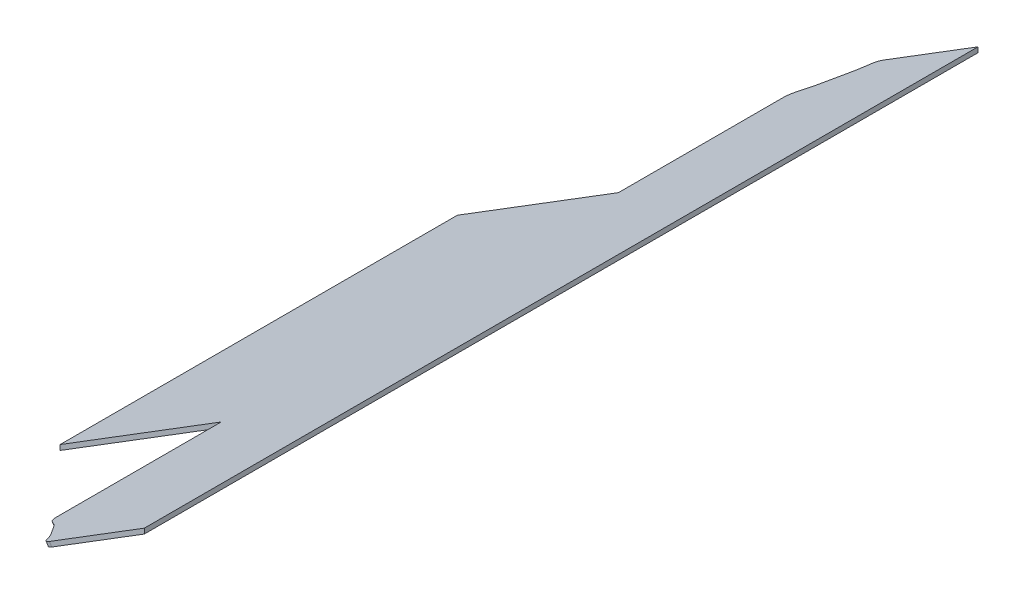
ISO-10303-21;
HEADER;
FILE_DESCRIPTION(('STEP AP214'),'2;1');
FILE_NAME('part.step','',(''),(''),'','','');
FILE_SCHEMA(('AUTOMOTIVE_DESIGN { 1 0 10303 214 1 1 1 1 }'));
ENDSEC;
DATA;
#1=APPLICATION_CONTEXT('core data for automotive mechanical design processes');
#2=APPLICATION_PROTOCOL_DEFINITION('international standard','automotive_design',2000,#1);
#3=PRODUCT_CONTEXT('',#1,'mechanical');
#4=PRODUCT('Part','Part','',(#3));
#5=PRODUCT_RELATED_PRODUCT_CATEGORY('part','',(#4));
#6=PRODUCT_DEFINITION_FORMATION('','',#4);
#7=PRODUCT_DEFINITION_CONTEXT('part definition',#1,'design');
#8=PRODUCT_DEFINITION('design','',#6,#7);
#9=PRODUCT_DEFINITION_SHAPE('','',#8);
#10=(LENGTH_UNIT() NAMED_UNIT(*) SI_UNIT(.MILLI.,.METRE.));
#11=(NAMED_UNIT(*) PLANE_ANGLE_UNIT() SI_UNIT($,.RADIAN.));
#12=(NAMED_UNIT(*) SI_UNIT($,.STERADIAN.) SOLID_ANGLE_UNIT());
#13=UNCERTAINTY_MEASURE_WITH_UNIT(LENGTH_MEASURE(1.E-05),#10,'distance_accuracy_value','');
#14=(GEOMETRIC_REPRESENTATION_CONTEXT(3) GLOBAL_UNCERTAINTY_ASSIGNED_CONTEXT((#13)) GLOBAL_UNIT_ASSIGNED_CONTEXT((#10,
#11,#12)) REPRESENTATION_CONTEXT('',''));
#15=CARTESIAN_POINT('',(0.,0.,0.));
#16=DIRECTION('',(0.,0.,1.));
#17=DIRECTION('',(1.,0.,0.));
#18=AXIS2_PLACEMENT_3D('',#15,#16,#17);
#19=CARTESIAN_POINT('',(541.055631695231,-76.6987176704867,-402.));
#20=DIRECTION('',(0.,0.,-1.));
#21=DIRECTION('',(-1.,0.,0.));
#22=AXIS2_PLACEMENT_3D('',#19,#20,#21);
#23=PLANE('',#22);
#24=DIRECTION('',(-0.849358835243342,-0.527815847615505,0.));
#25=VECTOR('',#24,1.);
#26=CARTESIAN_POINT('',(541.055631695231,-76.6987176704867,-402.));
#27=LINE('',#26,#25);
#28=CARTESIAN_POINT('',(540.,-77.3547173668089,-402.));
#29=VERTEX_POINT('',#28);
#30=CARTESIAN_POINT('',(497.563195868681,-103.726159934128,-402.));
#31=VERTEX_POINT('',#30);
#32=EDGE_CURVE('E179',#29,#31,#27,.T.);
#33=ORIENTED_EDGE('',*,*,#32,.T.);
#34=DIRECTION('',(-0.527815847615505,0.849358835243342,0.));
#35=VECTOR('',#34,1.);
#36=CARTESIAN_POINT('',(496.50756417345,-102.027442263642,-402.));
#37=LINE('',#36,#35);
#38=CARTESIAN_POINT('',(496.50756417345,-102.027442263642,-402.));
#39=VERTEX_POINT('',#38);
#40=EDGE_CURVE('E48',#31,#39,#37,.T.);
#41=ORIENTED_EDGE('',*,*,#40,.T.);
#42=DIRECTION('',(-0.849358835243342,-0.527815847615505,0.));
#43=VECTOR('',#42,1.);
#44=CARTESIAN_POINT('',(540.,-75.,-402.));
#45=LINE('',#44,#43);
#46=CARTESIAN_POINT('',(540.,-75.,-402.));
#47=VERTEX_POINT('',#46);
#48=EDGE_CURVE('E178',#47,#39,#45,.T.);
#49=ORIENTED_EDGE('',*,*,#48,.F.);
#50=DIRECTION('',(0.,1.,0.));
#51=VECTOR('',#50,1.);
#52=CARTESIAN_POINT('',(540.,-75.,-402.));
#53=LINE('',#52,#51);
#54=EDGE_CURVE('E198',#29,#47,#53,.T.);
#55=ORIENTED_EDGE('',*,*,#54,.F.);
#56=EDGE_LOOP('',(#33,#41,#49,#55));
#57=FACE_BOUND('',#56,.T.);
#58=ADVANCED_FACE('F40',(#57),#23,.T.);
#59=CARTESIAN_POINT('',(540.,-75.,-20.));
#60=DIRECTION('',(1.,0.,0.));
#61=DIRECTION('',(0.,1.,0.));
#62=AXIS2_PLACEMENT_3D('',#59,#60,#61);
#63=PLANE('',#62);
#64=DIRECTION('',(0.,0.,-1.));
#65=VECTOR('',#64,1.);
#66=CARTESIAN_POINT('',(540.,-75.,-20.));
#67=LINE('',#66,#65);
#68=CARTESIAN_POINT('',(540.,-75.,-20.));
#69=VERTEX_POINT('',#68);
#70=EDGE_CURVE('E182',#69,#47,#67,.T.);
#71=ORIENTED_EDGE('',*,*,#70,.F.);
#72=DIRECTION('',(0.,1.,0.));
#73=VECTOR('',#72,1.);
#74=CARTESIAN_POINT('',(540.,-162.811924253464,-20.));
#75=LINE('',#74,#73);
#76=CARTESIAN_POINT('',(540.,-77.3547173668088,-20.));
#77=VERTEX_POINT('',#76);
#78=EDGE_CURVE('E205',#77,#69,#75,.T.);
#79=ORIENTED_EDGE('',*,*,#78,.F.);
#80=DIRECTION('',(0.,0.,-1.));
#81=VECTOR('',#80,1.);
#82=CARTESIAN_POINT('',(540.,-77.3547173668089,0.));
#83=LINE('',#82,#81);
#84=EDGE_CURVE('E185',#77,#29,#83,.T.);
#85=ORIENTED_EDGE('',*,*,#84,.T.);
#86=ORIENTED_EDGE('',*,*,#54,.T.);
#87=EDGE_LOOP('',(#71,#79,#85,#86));
#88=FACE_BOUND('',#87,.T.);
#89=ADVANCED_FACE('F309',(#88),#63,.T.);
#90=CARTESIAN_POINT('',(402.482655584692,-162.811924253465,-20.));
#91=DIRECTION('',(0.,0.,1.));
#92=DIRECTION('',(1.,0.,0.));
#93=AXIS2_PLACEMENT_3D('',#90,#91,#92);
#94=PLANE('',#93);
#95=DIRECTION('',(0.849358835243342,0.527815847615505,0.));
#96=VECTOR('',#95,1.);
#97=CARTESIAN_POINT('',(401.427023889461,-161.113206582978,-20.));
#98=LINE('',#97,#96);
#99=CARTESIAN_POINT('',(496.50756417345,-102.027442263642,-20.));
#100=VERTEX_POINT('',#99);
#101=EDGE_CURVE('E190',#100,#69,#98,.T.);
#102=ORIENTED_EDGE('',*,*,#101,.F.);
#103=DIRECTION('',(-0.527815847615505,0.849358835243342,0.));
#104=VECTOR('',#103,1.);
#105=CARTESIAN_POINT('',(497.563195868681,-103.726159934128,-20.));
#106=LINE('',#105,#104);
#107=CARTESIAN_POINT('',(497.563195868681,-103.726159934128,-20.));
#108=VERTEX_POINT('',#107);
#109=EDGE_CURVE('E203',#100,#108,#106,.F.);
#110=ORIENTED_EDGE('',*,*,#109,.T.);
#111=DIRECTION('',(0.849358835243342,0.527815847615505,0.));
#112=VECTOR('',#111,1.);
#113=CARTESIAN_POINT('',(402.482655584692,-162.811924253465,-20.));
#114=LINE('',#113,#112);
#115=EDGE_CURVE('E183',#108,#77,#114,.T.);
#116=ORIENTED_EDGE('',*,*,#115,.T.);
#117=ORIENTED_EDGE('',*,*,#78,.T.);
#118=EDGE_LOOP('',(#102,#110,#116,#117));
#119=FACE_BOUND('',#118,.T.);
#120=ADVANCED_FACE('F314',(#119),#94,.T.);
#121=CARTESIAN_POINT('',(401.427023889461,-161.113206582978,-402.));
#122=DIRECTION('',(-1.,0.,0.));
#123=DIRECTION('',(0.,-1.,0.));
#124=AXIS2_PLACEMENT_3D('',#121,#122,#123);
#125=PLANE('',#124);
#126=DIRECTION('',(0.,-1.,0.));
#127=VECTOR('',#126,1.);
#128=CARTESIAN_POINT('',(401.427023889461,-53.1268140620597,-302.));
#129=LINE('',#128,#127);
#130=CARTESIAN_POINT('',(401.427023889461,-161.113206582978,-302.));
#131=VERTEX_POINT('',#130);
#132=CARTESIAN_POINT('',(401.427023889461,-163.467923949787,-302.));
#133=VERTEX_POINT('',#132);
#134=EDGE_CURVE('E159',#131,#133,#129,.T.);
#135=ORIENTED_EDGE('',*,*,#134,.T.);
#136=DIRECTION('',(0.,0.,1.));
#137=VECTOR('',#136,1.);
#138=CARTESIAN_POINT('',(401.427023889461,-163.467923949787,0.));
#139=LINE('',#138,#137);
#140=CARTESIAN_POINT('',(401.427023889461,-163.467923949787,-120.));
#141=VERTEX_POINT('',#140);
#142=EDGE_CURVE('E165',#133,#141,#139,.T.);
#143=ORIENTED_EDGE('',*,*,#142,.T.);
#144=DIRECTION('',(0.,-1.,0.));
#145=VECTOR('',#144,1.);
#146=CARTESIAN_POINT('',(401.427023889461,-161.113206582978,-120.));
#147=LINE('',#146,#145);
#148=CARTESIAN_POINT('',(401.427023889461,-161.113206582978,-120.));
#149=VERTEX_POINT('',#148);
#150=EDGE_CURVE('E175',#149,#141,#147,.T.);
#151=ORIENTED_EDGE('',*,*,#150,.F.);
#152=DIRECTION('',(0.,0.,1.));
#153=VECTOR('',#152,1.);
#154=CARTESIAN_POINT('',(401.427023889461,-161.113206582978,-402.));
#155=LINE('',#154,#153);
#156=EDGE_CURVE('E188',#131,#149,#155,.T.);
#157=ORIENTED_EDGE('',*,*,#156,.F.);
#158=EDGE_LOOP('',(#135,#143,#151,#157));
#159=FACE_BOUND('',#158,.T.);
#160=ADVANCED_FACE('F302',(#159),#125,.T.);
#161=CARTESIAN_POINT('',(185.116877968557,-297.88922891492,0.));
#162=DIRECTION('',(-0.527815847615505,0.849358835243342,0.));
#163=DIRECTION('',(-0.849358835243342,-0.527815847615505,0.));
#164=AXIS2_PLACEMENT_3D('',#161,#162,#163);
#165=PLANE('',#164);
#166=ORIENTED_EDGE('',*,*,#115,.F.);
#167=CARTESIAN_POINT('',(497.563195868681,-103.726159934128,-24.9999999999999));
#168=DIRECTION('',(-0.527815847615505,0.849358835243342,0.));
#169=DIRECTION('',(-0.849358835243342,-0.527815847615505,0.));
#170=AXIS2_PLACEMENT_3D('',#167,#168,#169);
#171=CIRCLE('',#170,5.);
#172=CARTESIAN_POINT('',(493.868957928557,-106.021864939777,-22.5337590205372));
#173=VERTEX_POINT('',#172);
#174=EDGE_CURVE('E222',#108,#173,#171,.F.);
#175=ORIENTED_EDGE('',*,*,#174,.T.);
#176=CARTESIAN_POINT('',(476.285871518514,-116.948497208875,-42.));
#177=CARTESIAN_POINT('',(479.252121913213,-115.105184463598,-39.9428083779639));
#178=CARTESIAN_POINT('',(483.497204374044,-112.467168934367,-36.6607125587044));
#179=CARTESIAN_POINT('',(487.786131782636,-109.801906901885,-31.0607814123332));
#180=CARTESIAN_POINT('',(491.811302310751,-107.300550930842,-26.6967487919227));
#181=CARTESIAN_POINT('',(493.914817597638,-105.993366431134,-22.694365368637));
#182=CARTESIAN_POINT('',(494.971765893868,-105.336548561334,-20.));
#183=B_SPLINE_CURVE_WITH_KNOTS('',3,(#176,#177,#178,#179,#180,#181,#182),.UNSPECIFIED.,.F.,.F.,
(4,1,1,1,4),(0.,0.388085015330354,0.560148038296808,0.716552584070787,1.),.UNSPECIFIED.);
#184=CARTESIAN_POINT('',(478.273998059131,-115.71301857292,-40.579159820833));
#185=VERTEX_POINT('',#184);
#186=EDGE_CURVE('E259',#185,#173,#183,.T.);
#187=ORIENTED_EDGE('',*,*,#186,.F.);
#188=CARTESIAN_POINT('',(480.532665694731,-114.309417970797,-44.813345204306));
#189=DIRECTION('',(-0.527815847615505,0.849358835243342,0.));
#190=DIRECTION('',(-0.849358835243342,-0.527815847615505,0.));
#191=AXIS2_PLACEMENT_3D('',#188,#189,#190);
#192=CIRCLE('',#191,5.);
#193=CARTESIAN_POINT('',(476.285871518514,-116.948497208875,-44.813345204306));
#194=VERTEX_POINT('',#193);
#195=EDGE_CURVE('E220',#185,#194,#192,.F.);
#196=ORIENTED_EDGE('',*,*,#195,.T.);
#197=DIRECTION('',(0.,0.,1.));
#198=VECTOR('',#197,1.);
#199=CARTESIAN_POINT('',(476.285871518514,-116.948497208875,-120.));
#200=LINE('',#199,#198);
#201=CARTESIAN_POINT('',(476.285871518514,-116.948497208875,-120.));
#202=VERTEX_POINT('',#201);
#203=EDGE_CURVE('E172',#202,#194,#200,.T.);
#204=ORIENTED_EDGE('',*,*,#203,.F.);
#205=DIRECTION('',(0.849358835243341,0.527815847615505,0.));
#206=VECTOR('',#205,1.);
#207=CARTESIAN_POINT('',(402.482655584692,-162.811924253465,-120.));
#208=LINE('',#207,#206);
#209=EDGE_CURVE('E169',#141,#202,#208,.T.);
#210=ORIENTED_EDGE('',*,*,#209,.F.);
#211=ORIENTED_EDGE('',*,*,#142,.F.);
#212=DIRECTION('',(-0.849358835243341,-0.527815847615505,0.));
#213=VECTOR('',#212,1.);
#214=CARTESIAN_POINT('',(476.285871518514,-116.948497208875,-302.));
#215=LINE('',#214,#213);
#216=CARTESIAN_POINT('',(476.285871518514,-116.948497208875,-302.));
#217=VERTEX_POINT('',#216);
#218=EDGE_CURVE('E151',#217,#133,#215,.T.);
#219=ORIENTED_EDGE('',*,*,#218,.F.);
#220=DIRECTION('',(0.,0.,1.));
#221=VECTOR('',#220,1.);
#222=CARTESIAN_POINT('',(476.285871518514,-116.948497208875,-402.));
#223=LINE('',#222,#221);
#224=CARTESIAN_POINT('',(476.285871518514,-116.948497208875,-377.186654795694));
#225=VERTEX_POINT('',#224);
#226=EDGE_CURVE('E143',#225,#217,#223,.T.);
#227=ORIENTED_EDGE('',*,*,#226,.F.);
#228=CARTESIAN_POINT('',(480.532665694732,-114.309417970797,-377.186654795694));
#229=DIRECTION('',(-0.527815847615505,0.849358835243342,0.));
#230=DIRECTION('',(-0.849358835243342,-0.527815847615505,0.));
#231=AXIS2_PLACEMENT_3D('',#228,#229,#230);
#232=CIRCLE('',#231,5.);
#233=CARTESIAN_POINT('',(478.273998059132,-115.71301857292,-381.420840179167));
#234=VERTEX_POINT('',#233);
#235=EDGE_CURVE('E216',#225,#234,#232,.F.);
#236=ORIENTED_EDGE('',*,*,#235,.T.);
#237=CARTESIAN_POINT('',(494.971765893868,-105.336548561334,-402.));
#238=CARTESIAN_POINT('',(493.914817597639,-105.993366431134,-399.305634631363));
#239=CARTESIAN_POINT('',(491.811302310751,-107.300550930842,-395.303251208077));
#240=CARTESIAN_POINT('',(487.786131782636,-109.801906901885,-390.939218587667));
#241=CARTESIAN_POINT('',(483.497204374044,-112.467168934367,-385.339287441296));
#242=CARTESIAN_POINT('',(479.252121913213,-115.105184463598,-382.057191622036));
#243=CARTESIAN_POINT('',(476.285871518514,-116.948497208875,-380.));
#244=B_SPLINE_CURVE_WITH_KNOTS('',3,(#237,#238,#239,#240,#241,#242,#243),.UNSPECIFIED.,.F.,.F.,
(4,1,1,1,4),(0.,0.283447415929213,0.439851961703192,0.611914984669646,1.),.UNSPECIFIED.);
#245=CARTESIAN_POINT('',(493.868957928556,-106.021864939777,-399.466240979463));
#246=VERTEX_POINT('',#245);
#247=EDGE_CURVE('E256',#246,#234,#244,.T.);
#248=ORIENTED_EDGE('',*,*,#247,.F.);
#249=CARTESIAN_POINT('',(497.563195868681,-103.726159934128,-397.));
#250=DIRECTION('',(-0.527815847615505,0.849358835243342,0.));
#251=DIRECTION('',(-0.849358835243342,-0.527815847615505,0.));
#252=AXIS2_PLACEMENT_3D('',#249,#250,#251);
#253=CIRCLE('',#252,5.);
#254=EDGE_CURVE('E218',#246,#31,#253,.F.);
#255=ORIENTED_EDGE('',*,*,#254,.T.);
#256=ORIENTED_EDGE('',*,*,#32,.F.);
#257=ORIENTED_EDGE('',*,*,#84,.F.);
#258=EDGE_LOOP('',(#166,#175,#187,#196,#204,#210,#211,#219,#227,#236,#248,#255,#256,#257));
#259=FACE_BOUND('',#258,.T.);
#260=ADVANCED_FACE('F163',(#259),#165,.F.);
#261=CARTESIAN_POINT('',(184.061246273326,-296.190511244433,0.));
#262=DIRECTION('',(-0.527815847615505,0.849358835243342,0.));
#263=DIRECTION('',(-0.849358835243342,-0.527815847615505,0.));
#264=AXIS2_PLACEMENT_3D('',#261,#262,#263);
#265=PLANE('',#264);
#266=CARTESIAN_POINT('',(475.230239823283,-115.249779538388,-42.));
#267=CARTESIAN_POINT('',(478.196490217982,-113.406466793112,-39.9428083779639));
#268=CARTESIAN_POINT('',(482.441572678813,-110.768451263881,-36.6607125587044));
#269=CARTESIAN_POINT('',(486.730500087405,-108.103189231399,-31.0607814123332));
#270=CARTESIAN_POINT('',(490.75567061552,-105.601833260356,-26.6967487919227));
#271=CARTESIAN_POINT('',(492.859185902407,-104.294648760647,-22.694365368637));
#272=CARTESIAN_POINT('',(493.916134198637,-103.637830890847,-20.));
#273=B_SPLINE_CURVE_WITH_KNOTS('',3,(#266,#267,#268,#269,#270,#271,#272),.UNSPECIFIED.,.F.,.F.,
(4,1,1,1,4),(0.,0.388085015330354,0.560148038296808,0.716552584070787,1.),.UNSPECIFIED.);
#274=CARTESIAN_POINT('',(492.813326233326,-104.323147269291,-22.5337590205371));
#275=VERTEX_POINT('',#274);
#276=CARTESIAN_POINT('',(477.2183663639,-114.014300902433,-40.579159820833));
#277=VERTEX_POINT('',#276);
#278=EDGE_CURVE('E152',#275,#277,#273,.F.);
#279=ORIENTED_EDGE('',*,*,#278,.F.);
#280=CARTESIAN_POINT('',(496.50756417345,-102.027442263642,-24.9999999999999));
#281=DIRECTION('',(-0.527815847615505,0.849358835243342,0.));
#282=DIRECTION('',(-0.849358835243342,-0.527815847615505,0.));
#283=AXIS2_PLACEMENT_3D('',#280,#281,#282);
#284=CIRCLE('',#283,5.);
#285=EDGE_CURVE('E232',#275,#100,#284,.T.);
#286=ORIENTED_EDGE('',*,*,#285,.T.);
#287=ORIENTED_EDGE('',*,*,#101,.T.);
#288=ORIENTED_EDGE('',*,*,#70,.T.);
#289=ORIENTED_EDGE('',*,*,#48,.T.);
#290=CARTESIAN_POINT('',(496.50756417345,-102.027442263642,-397.));
#291=DIRECTION('',(-0.527815847615505,0.849358835243342,0.));
#292=DIRECTION('',(-0.849358835243342,-0.527815847615505,0.));
#293=AXIS2_PLACEMENT_3D('',#290,#291,#292);
#294=CIRCLE('',#293,5.);
#295=CARTESIAN_POINT('',(492.813326233326,-104.323147269291,-399.466240979463));
#296=VERTEX_POINT('',#295);
#297=EDGE_CURVE('E229',#39,#296,#294,.T.);
#298=ORIENTED_EDGE('',*,*,#297,.T.);
#299=CARTESIAN_POINT('',(493.916134198637,-103.637830890847,-402.));
#300=CARTESIAN_POINT('',(492.859185902408,-104.294648760647,-399.305634631363));
#301=CARTESIAN_POINT('',(490.75567061552,-105.601833260356,-395.303251208077));
#302=CARTESIAN_POINT('',(486.730500087405,-108.103189231398,-390.939218587667));
#303=CARTESIAN_POINT('',(482.441572678813,-110.768451263881,-385.339287441296));
#304=CARTESIAN_POINT('',(478.196490217982,-113.406466793111,-382.057191622036));
#305=CARTESIAN_POINT('',(475.230239823283,-115.249779538388,-380.));
#306=B_SPLINE_CURVE_WITH_KNOTS('',3,(#299,#300,#301,#302,#303,#304,#305),.UNSPECIFIED.,.F.,.F.,
(4,1,1,1,4),(0.,0.283447415929213,0.439851961703192,0.611914984669646,1.),.UNSPECIFIED.);
#307=CARTESIAN_POINT('',(477.218366363901,-114.014300902433,-381.420840179168));
#308=VERTEX_POINT('',#307);
#309=EDGE_CURVE('E258',#308,#296,#306,.F.);
#310=ORIENTED_EDGE('',*,*,#309,.F.);
#311=CARTESIAN_POINT('',(479.477033999501,-112.61070030031,-377.186654795694));
#312=DIRECTION('',(-0.527815847615505,0.849358835243342,0.));
#313=DIRECTION('',(-0.849358835243342,-0.527815847615505,0.));
#314=AXIS2_PLACEMENT_3D('',#311,#312,#313);
#315=CIRCLE('',#314,5.);
#316=CARTESIAN_POINT('',(475.230239823283,-115.249779538388,-377.186654795694));
#317=VERTEX_POINT('',#316);
#318=EDGE_CURVE('E63',#308,#317,#315,.T.);
#319=ORIENTED_EDGE('',*,*,#318,.T.);
#320=DIRECTION('',(0.,0.,-1.));
#321=VECTOR('',#320,1.);
#322=CARTESIAN_POINT('',(475.230239823283,-115.249779538388,3.73483662304239E-13));
#323=LINE('',#322,#321);
#324=CARTESIAN_POINT('',(475.230239823283,-115.249779538388,-302.));
#325=VERTEX_POINT('',#324);
#326=EDGE_CURVE('E200',#325,#317,#323,.T.);
#327=ORIENTED_EDGE('',*,*,#326,.F.);
#328=DIRECTION('',(0.849358835243342,0.527815847615505,0.));
#329=VECTOR('',#328,1.);
#330=CARTESIAN_POINT('',(184.061246273326,-296.190511244433,-302.));
#331=LINE('',#330,#329);
#332=EDGE_CURVE('E158',#131,#325,#331,.T.);
#333=ORIENTED_EDGE('',*,*,#332,.F.);
#334=ORIENTED_EDGE('',*,*,#156,.T.);
#335=DIRECTION('',(-0.849358835243342,-0.527815847615505,0.));
#336=VECTOR('',#335,1.);
#337=CARTESIAN_POINT('',(184.061246273326,-296.190511244433,-120.));
#338=LINE('',#337,#336);
#339=CARTESIAN_POINT('',(475.230239823283,-115.249779538388,-120.));
#340=VERTEX_POINT('',#339);
#341=EDGE_CURVE('E194',#340,#149,#338,.T.);
#342=ORIENTED_EDGE('',*,*,#341,.F.);
#343=DIRECTION('',(0.,0.,-1.));
#344=VECTOR('',#343,1.);
#345=CARTESIAN_POINT('',(475.230239823283,-115.249779538388,0.));
#346=LINE('',#345,#344);
#347=CARTESIAN_POINT('',(475.230239823283,-115.249779538388,-44.813345204306));
#348=VERTEX_POINT('',#347);
#349=EDGE_CURVE('E197',#348,#340,#346,.T.);
#350=ORIENTED_EDGE('',*,*,#349,.F.);
#351=CARTESIAN_POINT('',(479.4770339995,-112.610700300311,-44.813345204306));
#352=DIRECTION('',(-0.527815847615505,0.849358835243342,0.));
#353=DIRECTION('',(-0.849358835243342,-0.527815847615505,0.));
#354=AXIS2_PLACEMENT_3D('',#351,#352,#353);
#355=CIRCLE('',#354,5.);
#356=EDGE_CURVE('E55',#348,#277,#355,.T.);
#357=ORIENTED_EDGE('',*,*,#356,.T.);
#358=EDGE_LOOP('',(#279,#286,#287,#288,#289,#298,#310,#319,#327,#333,#334,#342,#350,#357));
#359=FACE_BOUND('',#358,.T.);
#360=ADVANCED_FACE('F247',(#359),#265,.T.);
#361=CARTESIAN_POINT('',(436.625254134422,-53.1268140620599,-120.));
#362=DIRECTION('',(0.849358835243342,0.527815847615505,0.));
#363=DIRECTION('',(-0.527815847615505,0.849358835243342,0.));
#364=AXIS2_PLACEMENT_3D('',#361,#362,#363);
#365=PLANE('',#364);
#366=ORIENTED_EDGE('',*,*,#203,.T.);
#367=DIRECTION('',(0.527815847615505,-0.849358835243342,0.));
#368=VECTOR('',#367,1.);
#369=CARTESIAN_POINT('',(436.625254134422,-53.1268140620599,-44.813345204306));
#370=LINE('',#369,#368);
#371=EDGE_CURVE('E234',#194,#348,#370,.F.);
#372=ORIENTED_EDGE('',*,*,#371,.T.);
#373=ORIENTED_EDGE('',*,*,#349,.T.);
#374=DIRECTION('',(0.527815847615505,-0.849358835243342,0.));
#375=VECTOR('',#374,1.);
#376=CARTESIAN_POINT('',(436.625254134422,-53.1268140620599,-120.));
#377=LINE('',#376,#375);
#378=EDGE_CURVE('E176',#340,#202,#377,.T.);
#379=ORIENTED_EDGE('',*,*,#378,.T.);
#380=EDGE_LOOP('',(#366,#372,#373,#379));
#381=FACE_BOUND('',#380,.T.);
#382=ADVANCED_FACE('F293',(#381),#365,.F.);
#383=CARTESIAN_POINT('',(362.8220382006,-98.9902411066496,-120.));
#384=DIRECTION('',(0.,0.,-1.));
#385=DIRECTION('',(-1.,0.,0.));
#386=AXIS2_PLACEMENT_3D('',#383,#384,#385);
#387=PLANE('',#386);
#388=ORIENTED_EDGE('',*,*,#341,.T.);
#389=ORIENTED_EDGE('',*,*,#150,.T.);
#390=ORIENTED_EDGE('',*,*,#209,.T.);
#391=ORIENTED_EDGE('',*,*,#378,.F.);
#392=EDGE_LOOP('',(#388,#389,#390,#391));
#393=FACE_BOUND('',#392,.T.);
#394=ADVANCED_FACE('F298',(#393),#387,.F.);
#395=CARTESIAN_POINT('',(436.625254134422,-53.1268140620599,-302.));
#396=DIRECTION('',(0.,0.,1.));
#397=DIRECTION('',(1.,0.,0.));
#398=AXIS2_PLACEMENT_3D('',#395,#396,#397);
#399=PLANE('',#398);
#400=ORIENTED_EDGE('',*,*,#332,.T.);
#401=DIRECTION('',(0.527815847615505,-0.849358835243341,0.));
#402=VECTOR('',#401,1.);
#403=CARTESIAN_POINT('',(436.625254134422,-53.1268140620599,-302.));
#404=LINE('',#403,#402);
#405=EDGE_CURVE('E146',#325,#217,#404,.T.);
#406=ORIENTED_EDGE('',*,*,#405,.T.);
#407=ORIENTED_EDGE('',*,*,#218,.T.);
#408=ORIENTED_EDGE('',*,*,#134,.F.);
#409=EDGE_LOOP('',(#400,#406,#407,#408));
#410=FACE_BOUND('',#409,.T.);
#411=ADVANCED_FACE('F155',(#410),#399,.F.);
#412=CARTESIAN_POINT('',(436.625254134422,-53.1268140620598,-402.));
#413=DIRECTION('',(0.849358835243341,0.527815847615505,0.));
#414=DIRECTION('',(-0.527815847615505,0.849358835243342,0.));
#415=AXIS2_PLACEMENT_3D('',#412,#413,#414);
#416=PLANE('',#415);
#417=ORIENTED_EDGE('',*,*,#326,.T.);
#418=DIRECTION('',(0.527815847615505,-0.849358835243342,0.));
#419=VECTOR('',#418,1.);
#420=CARTESIAN_POINT('',(436.625254134422,-53.1268140620598,-377.186654795694));
#421=LINE('',#420,#419);
#422=EDGE_CURVE('E11',#317,#225,#421,.T.);
#423=ORIENTED_EDGE('',*,*,#422,.T.);
#424=ORIENTED_EDGE('',*,*,#226,.T.);
#425=ORIENTED_EDGE('',*,*,#405,.F.);
#426=EDGE_LOOP('',(#417,#423,#424,#425));
#427=FACE_BOUND('',#426,.T.);
#428=ADVANCED_FACE('F145',(#427),#416,.F.);
#429=CARTESIAN_POINT('',(455.311148509776,-41.5148654145187,-402.));
#430=CARTESIAN_POINT('',(454.254200213546,-42.1716832843184,-399.305634631363));
#431=CARTESIAN_POINT('',(452.150684926659,-43.4788677840272,-395.303251208077));
#432=CARTESIAN_POINT('',(448.125514398544,-45.98022375507,-390.939218587667));
#433=CARTESIAN_POINT('',(443.836586989952,-48.6454857875523,-385.339287441296));
#434=CARTESIAN_POINT('',(439.591504529121,-51.283501316783,-382.057191622036));
#435=CARTESIAN_POINT('',(436.625254134422,-53.1268140620598,-380.));
#436=B_SPLINE_CURVE_WITH_KNOTS('',3,(#429,#430,#431,#432,#433,#434,#435),.UNSPECIFIED.,.F.,.F.,
(4,1,1,1,4),(0.,0.283447415929213,0.439851961703192,0.611914984669646,1.),.UNSPECIFIED.);
#437=DIRECTION('',(0.527815847615505,-0.849358835243342,0.));
#438=VECTOR('',#437,1.);
#439=SURFACE_OF_LINEAR_EXTRUSION('',#436,#438);
#440=ORIENTED_EDGE('',*,*,#309,.T.);
#441=DIRECTION('',(0.527815847615505,-0.849358835243342,0.));
#442=VECTOR('',#441,1.);
#443=CARTESIAN_POINT('',(492.813326233326,-104.323147269291,-399.466240979463));
#444=LINE('',#443,#442);
#445=EDGE_CURVE('E238',#296,#246,#444,.T.);
#446=ORIENTED_EDGE('',*,*,#445,.T.);
#447=ORIENTED_EDGE('',*,*,#247,.T.);
#448=DIRECTION('',(0.527815847615505,-0.849358835243342,0.));
#449=VECTOR('',#448,1.);
#450=CARTESIAN_POINT('',(478.273998059132,-115.71301857292,-381.420840179167));
#451=LINE('',#450,#449);
#452=EDGE_CURVE('E236',#234,#308,#451,.F.);
#453=ORIENTED_EDGE('',*,*,#452,.T.);
#454=EDGE_LOOP('',(#440,#446,#447,#453));
#455=FACE_BOUND('',#454,.T.);
#456=ADVANCED_FACE('F255',(#455),#439,.F.);
#457=CARTESIAN_POINT('',(436.625254134422,-53.1268140620598,-42.));
#458=CARTESIAN_POINT('',(439.59150452912,-51.2835013167831,-39.9428083779639));
#459=CARTESIAN_POINT('',(443.836586989952,-48.6454857875522,-36.6607125587044));
#460=CARTESIAN_POINT('',(448.125514398544,-45.9802237550701,-31.0607814123332));
#461=CARTESIAN_POINT('',(452.150684926659,-43.4788677840272,-26.6967487919227));
#462=CARTESIAN_POINT('',(454.254200213546,-42.1716832843184,-22.694365368637));
#463=CARTESIAN_POINT('',(455.311148509776,-41.5148654145187,-20.));
#464=B_SPLINE_CURVE_WITH_KNOTS('',3,(#457,#458,#459,#460,#461,#462,#463),.UNSPECIFIED.,.F.,.F.,
(4,1,1,1,4),(0.,0.388085015330354,0.560148038296808,0.716552584070787,1.),.UNSPECIFIED.);
#465=DIRECTION('',(0.527815847615505,-0.849358835243342,0.));
#466=VECTOR('',#465,1.);
#467=SURFACE_OF_LINEAR_EXTRUSION('',#464,#466);
#468=ORIENTED_EDGE('',*,*,#186,.T.);
#469=DIRECTION('',(0.527815847615505,-0.849358835243342,0.));
#470=VECTOR('',#469,1.);
#471=CARTESIAN_POINT('',(493.868957928556,-106.021864939777,-22.5337590205372));
#472=LINE('',#471,#470);
#473=EDGE_CURVE('E226',#173,#275,#472,.F.);
#474=ORIENTED_EDGE('',*,*,#473,.T.);
#475=ORIENTED_EDGE('',*,*,#278,.T.);
#476=DIRECTION('',(0.527815847615505,-0.849358835243342,0.));
#477=VECTOR('',#476,1.);
#478=CARTESIAN_POINT('',(477.2183663639,-114.014300902433,-40.579159820833));
#479=LINE('',#478,#477);
#480=EDGE_CURVE('E224',#277,#185,#479,.T.);
#481=ORIENTED_EDGE('',*,*,#480,.T.);
#482=EDGE_LOOP('',(#468,#474,#475,#481));
#483=FACE_BOUND('',#482,.T.);
#484=ADVANCED_FACE('F285',(#483),#467,.F.);
#485=CARTESIAN_POINT('',(497.035380021066,-102.876801098885,-24.9999999999999));
#486=DIRECTION('',(0.527815847615505,-0.849358835243342,0.));
#487=DIRECTION('',(0.849358835243342,0.527815847615505,0.));
#488=AXIS2_PLACEMENT_3D('',#485,#486,#487);
#489=CYLINDRICAL_SURFACE('',#488,5.);
#490=ORIENTED_EDGE('',*,*,#285,.F.);
#491=ORIENTED_EDGE('',*,*,#473,.F.);
#492=ORIENTED_EDGE('',*,*,#174,.F.);
#493=ORIENTED_EDGE('',*,*,#109,.F.);
#494=EDGE_LOOP('',(#490,#491,#492,#493));
#495=FACE_BOUND('',#494,.T.);
#496=ADVANCED_FACE('F322',(#495),#489,.T.);
#497=CARTESIAN_POINT('',(480.004849847116,-113.460059135554,-44.813345204306));
#498=DIRECTION('',(0.527815847615505,-0.849358835243342,0.));
#499=DIRECTION('',(0.849358835243342,0.527815847615505,0.));
#500=AXIS2_PLACEMENT_3D('',#497,#498,#499);
#501=CYLINDRICAL_SURFACE('',#500,5.);
#502=ORIENTED_EDGE('',*,*,#195,.F.);
#503=ORIENTED_EDGE('',*,*,#480,.F.);
#504=ORIENTED_EDGE('',*,*,#356,.F.);
#505=ORIENTED_EDGE('',*,*,#371,.F.);
#506=EDGE_LOOP('',(#502,#503,#504,#505));
#507=FACE_BOUND('',#506,.T.);
#508=ADVANCED_FACE('F290',(#507),#501,.T.);
#509=CARTESIAN_POINT('',(497.035380021066,-102.876801098885,-397.));
#510=DIRECTION('',(0.527815847615505,-0.849358835243342,0.));
#511=DIRECTION('',(0.849358835243342,0.527815847615505,0.));
#512=AXIS2_PLACEMENT_3D('',#509,#510,#511);
#513=CYLINDRICAL_SURFACE('',#512,5.);
#514=ORIENTED_EDGE('',*,*,#297,.F.);
#515=ORIENTED_EDGE('',*,*,#40,.F.);
#516=ORIENTED_EDGE('',*,*,#254,.F.);
#517=ORIENTED_EDGE('',*,*,#445,.F.);
#518=EDGE_LOOP('',(#514,#515,#516,#517));
#519=FACE_BOUND('',#518,.T.);
#520=ADVANCED_FACE('F251',(#519),#513,.T.);
#521=CARTESIAN_POINT('',(480.004849847116,-113.460059135554,-377.186654795694));
#522=DIRECTION('',(0.527815847615505,-0.849358835243342,0.));
#523=DIRECTION('',(0.849358835243342,0.527815847615505,0.));
#524=AXIS2_PLACEMENT_3D('',#521,#522,#523);
#525=CYLINDRICAL_SURFACE('',#524,5.);
#526=ORIENTED_EDGE('',*,*,#318,.F.);
#527=ORIENTED_EDGE('',*,*,#452,.F.);
#528=ORIENTED_EDGE('',*,*,#235,.F.);
#529=ORIENTED_EDGE('',*,*,#422,.F.);
#530=EDGE_LOOP('',(#526,#527,#528,#529));
#531=FACE_BOUND('',#530,.T.);
#532=ADVANCED_FACE('F42',(#531),#525,.T.);
#533=CLOSED_SHELL('',(#58,#89,#120,#160,#260,#360,#382,#394,#411,#428,#456,#484,#496,#508,#520,#532));
#534=MANIFOLD_SOLID_BREP('B2',#533);
#535=ADVANCED_BREP_SHAPE_REPRESENTATION('',(#18,#534),#14);
#536=SHAPE_DEFINITION_REPRESENTATION(#9,#535);
ENDSEC;
END-ISO-10303-21;
